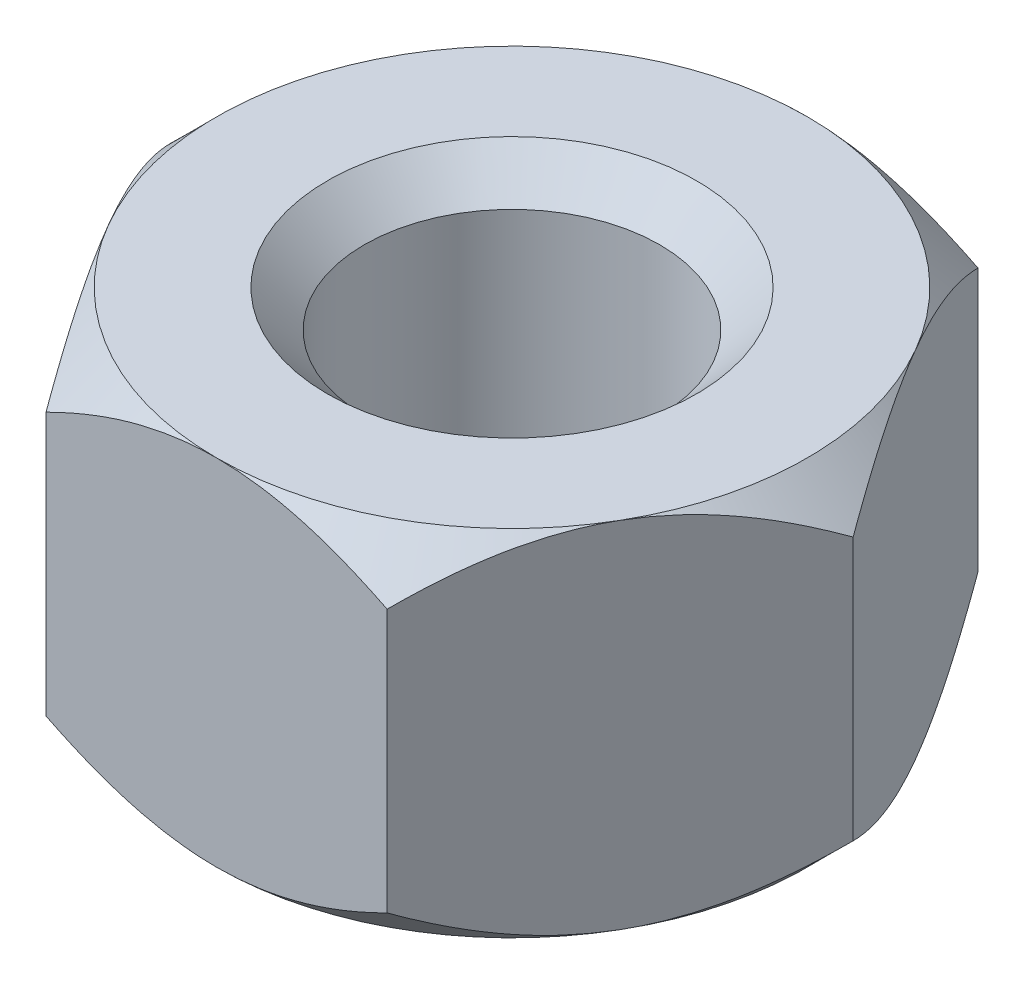
ISO-10303-21;
HEADER;
FILE_DESCRIPTION(('STEP AP214'),'2;1');
FILE_NAME('part.step','',(''),(''),'','','');
FILE_SCHEMA(('AUTOMOTIVE_DESIGN { 1 0 10303 214 1 1 1 1 }'));
ENDSEC;
DATA;
#1=APPLICATION_CONTEXT('core data for automotive mechanical design processes');
#2=APPLICATION_PROTOCOL_DEFINITION('international standard','automotive_design',2000,#1);
#3=PRODUCT_CONTEXT('',#1,'mechanical');
#4=PRODUCT('Part','Part','',(#3));
#5=PRODUCT_RELATED_PRODUCT_CATEGORY('part','',(#4));
#6=PRODUCT_DEFINITION_FORMATION('','',#4);
#7=PRODUCT_DEFINITION_CONTEXT('part definition',#1,'design');
#8=PRODUCT_DEFINITION('design','',#6,#7);
#9=PRODUCT_DEFINITION_SHAPE('','',#8);
#10=(LENGTH_UNIT() NAMED_UNIT(*) SI_UNIT(.MILLI.,.METRE.));
#11=(NAMED_UNIT(*) PLANE_ANGLE_UNIT() SI_UNIT($,.RADIAN.));
#12=(NAMED_UNIT(*) SI_UNIT($,.STERADIAN.) SOLID_ANGLE_UNIT());
#13=UNCERTAINTY_MEASURE_WITH_UNIT(LENGTH_MEASURE(1.E-05),#10,'distance_accuracy_value','');
#14=(GEOMETRIC_REPRESENTATION_CONTEXT(3) GLOBAL_UNCERTAINTY_ASSIGNED_CONTEXT((#13)) GLOBAL_UNIT_ASSIGNED_CONTEXT((#10,
#11,#12)) REPRESENTATION_CONTEXT('',''));
#15=CARTESIAN_POINT('',(0.,0.,0.));
#16=DIRECTION('',(0.,0.,1.));
#17=DIRECTION('',(1.,0.,0.));
#18=AXIS2_PLACEMENT_3D('',#15,#16,#17);
#19=CARTESIAN_POINT('',(0.,2.4,2.));
#20=DIRECTION('',(0.,0.,-1.));
#21=DIRECTION('',(-1.,0.,0.));
#22=AXIS2_PLACEMENT_3D('',#19,#20,#21);
#23=PLANE('',#22);
#24=CARTESIAN_POINT('',(-2.8291899408357,1.4647244798578,2.));
#25=CARTESIAN_POINT('',(-2.75794743497233,1.40656483846488,2.));
#26=CARTESIAN_POINT('',(-2.68635697593311,1.34882463802579,2.));
#27=CARTESIAN_POINT('',(-2.54230476757424,1.23440432711523,2.));
#28=CARTESIAN_POINT('',(-2.46984279924785,1.17772449265718,2.));
#29=CARTESIAN_POINT('',(-2.32311080175362,1.0650636720653,2.));
#30=CARTESIAN_POINT('',(-2.2488296662781,1.00909710308208,2.));
#31=CARTESIAN_POINT('',(-2.09903078687514,0.898854362479401,2.));
#32=CARTESIAN_POINT('',(-2.02351316164895,0.844578030034553,2.));
#33=CARTESIAN_POINT('',(-1.86406396813782,0.733345468454683,2.));
#34=CARTESIAN_POINT('',(-1.77999007510132,0.676592099687395,2.));
#35=CARTESIAN_POINT('',(-1.60961508455424,0.566443579679196,2.));
#36=CARTESIAN_POINT('',(-1.5233132907435,0.513049496705425,2.));
#37=CARTESIAN_POINT('',(-1.34842482772468,0.411062580526362,2.));
#38=CARTESIAN_POINT('',(-1.25985048529424,0.362448805104743,2.));
#39=CARTESIAN_POINT('',(-1.07958965182758,0.271445900810976,2.));
#40=CARTESIAN_POINT('',(-0.987905878867413,0.22905149963363,2.));
#41=CARTESIAN_POINT('',(-0.827220008254675,0.163453909358535,2.));
#42=CARTESIAN_POINT('',(-0.759060459986962,0.138201761805597,2.));
#43=CARTESIAN_POINT('',(-0.620921054554501,0.0931513278392925,2.));
#44=CARTESIAN_POINT('',(-0.550940948384456,0.0733537918137,2.));
#45=CARTESIAN_POINT('',(-0.410970866170769,0.0406797291698716,2.));
#46=CARTESIAN_POINT('',(-0.341014587421594,0.0276612891194157,2.));
#47=CARTESIAN_POINT('',(-0.200136764107186,0.00877832788195313,2.));
#48=CARTESIAN_POINT('',(-0.129215444692074,0.00291216600773918,2.));
#49=CARTESIAN_POINT('',(0.00930537263127748,-0.00111681136780149,2.));
#50=CARTESIAN_POINT('',(0.0768941424091716,0.00035078729153876,2.));
#51=CARTESIAN_POINT('',(0.211581548624999,0.0100379998375035,2.));
#52=CARTESIAN_POINT('',(0.27868014872778,0.0182581092496755,2.));
#53=CARTESIAN_POINT('',(0.413072803988463,0.0411162729747647,2.));
#54=CARTESIAN_POINT('',(0.480346226016125,0.0558736223264092,2.));
#55=CARTESIAN_POINT('',(0.613391847110031,0.0909640848891721,2.));
#56=CARTESIAN_POINT('',(0.679164086708457,0.111297047364406,2.));
#57=CARTESIAN_POINT('',(0.87826902904644,0.180713473259486,2.));
#58=CARTESIAN_POINT('',(1.00895593784598,0.237354634088662,2.));
#59=CARTESIAN_POINT('',(1.2642523527517,0.363457849088134,2.));
#60=CARTESIAN_POINT('',(1.38883880003726,0.432964414597252,2.));
#61=CARTESIAN_POINT('',(1.56893345594384,0.541543563498943,2.));
#62=CARTESIAN_POINT('',(1.62638925138213,0.577450474387938,2.));
#63=CARTESIAN_POINT('',(1.74031418052643,0.650808508938124,2.));
#64=CARTESIAN_POINT('',(1.79678324047045,0.688259747346152,2.));
#65=CARTESIAN_POINT('',(1.90841199745023,0.764122452153494,2.));
#66=CARTESIAN_POINT('',(1.96357854085903,0.802523895281548,2.));
#67=CARTESIAN_POINT('',(2.07315352459833,0.880363201789675,2.));
#68=CARTESIAN_POINT('',(2.1275621696592,0.919800776633909,2.));
#69=CARTESIAN_POINT('',(2.18165265473574,0.959663546066592,2.));
#70=B_SPLINE_CURVE_WITH_KNOTS('',3,(#24,#25,#26,#27,#28,#29,#30,#31,#32,#33,#34,#35,#36,#37,#38,
#39,#40,#41,#42,#43,#44,#45,#46,#47,#48,#49,#50,#51,#52,#53,#54,#55,#56,#57,#58,#59,#60,#61,#62,
#63,#64,#65,#66,#67,#68,#69),.UNSPECIFIED.,.F.,.F.,(4,2,2,2,2,2,2,2,2,2,2,2,2,2,2,2,2,2,2,2,2,2,
4),(0.,0.275907547813032,0.55188594224357,0.830881846747023,1.1098511232736,1.41410044793124,
1.7184460411623,2.02139261300563,2.32408086743551,2.54195930357539,2.75986769817752,
2.97300971438962,3.18610282797173,3.38856871258356,3.59104945625827,3.79738799829161,
4.00372096254256,4.42979047953389,4.85736262875748,5.06060251813806,5.26385753598405,
5.46549374474189,5.66707438606444),.UNSPECIFIED.);
#71=CARTESIAN_POINT('',(1.15470053837925,0.309401076758503,2.));
#72=VERTEX_POINT('',#71);
#73=CARTESIAN_POINT('',(0.,0.,2.));
#74=VERTEX_POINT('',#73);
#75=EDGE_CURVE('E124',#72,#74,#70,.F.);
#76=ORIENTED_EDGE('',*,*,#75,.F.);
#77=DIRECTION('',(0.,-1.,0.));
#78=VECTOR('',#77,1.);
#79=CARTESIAN_POINT('',(1.15470053837925,2.4,2.));
#80=LINE('',#79,#78);
#81=CARTESIAN_POINT('',(1.15470053837925,2.0905989232415,2.));
#82=VERTEX_POINT('',#81);
#83=EDGE_CURVE('E322',#82,#72,#80,.T.);
#84=ORIENTED_EDGE('',*,*,#83,.F.);
#85=CARTESIAN_POINT('',(-2.8291899408357,0.935275520142197,2.));
#86=CARTESIAN_POINT('',(-2.75794743497233,0.993435161535117,2.));
#87=CARTESIAN_POINT('',(-2.68635697593311,1.05117536197421,2.));
#88=CARTESIAN_POINT('',(-2.54230476757424,1.16559567288477,2.));
#89=CARTESIAN_POINT('',(-2.46984279924785,1.22227550734282,2.));
#90=CARTESIAN_POINT('',(-2.32311080175362,1.3349363279347,2.));
#91=CARTESIAN_POINT('',(-2.2488296662781,1.39090289691792,2.));
#92=CARTESIAN_POINT('',(-2.09903078687514,1.5011456375206,2.));
#93=CARTESIAN_POINT('',(-2.02351316164895,1.55542196996545,2.));
#94=CARTESIAN_POINT('',(-1.86406396813782,1.66665453154532,2.));
#95=CARTESIAN_POINT('',(-1.77999007510132,1.7234079003126,2.));
#96=CARTESIAN_POINT('',(-1.60961508455424,1.8335564203208,2.));
#97=CARTESIAN_POINT('',(-1.5233132907435,1.88695050329458,2.));
#98=CARTESIAN_POINT('',(-1.34842482772468,1.98893741947364,2.));
#99=CARTESIAN_POINT('',(-1.25985048529424,2.03755119489526,2.));
#100=CARTESIAN_POINT('',(-1.07958965182758,2.12855409918902,2.));
#101=CARTESIAN_POINT('',(-0.987905878867413,2.17094850036637,2.));
#102=CARTESIAN_POINT('',(-0.827220008254675,2.23654609064146,2.));
#103=CARTESIAN_POINT('',(-0.759060459986962,2.2617982381944,2.));
#104=CARTESIAN_POINT('',(-0.620921054554502,2.30684867216071,2.));
#105=CARTESIAN_POINT('',(-0.550940948384456,2.3266462081863,2.));
#106=CARTESIAN_POINT('',(-0.410970866170769,2.35932027083013,2.));
#107=CARTESIAN_POINT('',(-0.341014587421594,2.37233871088058,2.));
#108=CARTESIAN_POINT('',(-0.200136764107186,2.39122167211805,2.));
#109=CARTESIAN_POINT('',(-0.129215444692074,2.39708783399226,2.));
#110=CARTESIAN_POINT('',(0.0093053726312774,2.4011168113678,2.));
#111=CARTESIAN_POINT('',(0.0768941424091715,2.39964921270846,2.));
#112=CARTESIAN_POINT('',(0.211581548624998,2.3899620001625,2.));
#113=CARTESIAN_POINT('',(0.27868014872778,2.38174189075032,2.));
#114=CARTESIAN_POINT('',(0.413072803988463,2.35888372702523,2.));
#115=CARTESIAN_POINT('',(0.480346226016125,2.34412637767359,2.));
#116=CARTESIAN_POINT('',(0.613391847110031,2.30903591511083,2.));
#117=CARTESIAN_POINT('',(0.679164086708457,2.28870295263559,2.));
#118=CARTESIAN_POINT('',(0.878269029046439,2.21928652674051,2.));
#119=CARTESIAN_POINT('',(1.00895593784598,2.16264536591134,2.));
#120=CARTESIAN_POINT('',(1.2642523527517,2.03654215091187,2.));
#121=CARTESIAN_POINT('',(1.38883880003726,1.96703558540275,2.));
#122=CARTESIAN_POINT('',(1.56893345594384,1.85845643650106,2.));
#123=CARTESIAN_POINT('',(1.62638925138213,1.82254952561206,2.));
#124=CARTESIAN_POINT('',(1.74031418052643,1.74919149106188,2.));
#125=CARTESIAN_POINT('',(1.79678324047045,1.71174025265385,2.));
#126=CARTESIAN_POINT('',(1.90841199745023,1.63587754784651,2.));
#127=CARTESIAN_POINT('',(1.96357854085903,1.59747610471845,2.));
#128=CARTESIAN_POINT('',(2.07315352459833,1.51963679821032,2.));
#129=CARTESIAN_POINT('',(2.1275621696592,1.48019922336609,2.));
#130=CARTESIAN_POINT('',(2.18165265473573,1.44033645393341,2.));
#131=B_SPLINE_CURVE_WITH_KNOTS('',3,(#85,#86,#87,#88,#89,#90,#91,#92,#93,#94,#95,#96,#97,#98,
#99,#100,#101,#102,#103,#104,#105,#106,#107,#108,#109,#110,#111,#112,#113,#114,#115,#116,#117,
#118,#119,#120,#121,#122,#123,#124,#125,#126,#127,#128,#129,#130),.UNSPECIFIED.,.F.,.F.,(4,2,2,
2,2,2,2,2,2,2,2,2,2,2,2,2,2,2,2,2,2,2,4),(0.,0.275907547813032,0.55188594224357,
0.830881846747023,1.1098511232736,1.41410044793124,1.7184460411623,2.02139261300563,
2.32408086743551,2.54195930357539,2.75986769817752,2.97300971438962,3.18610282797173,
3.38856871258356,3.59104945625827,3.79738799829161,4.00372096254256,4.42979047953389,
4.85736262875748,5.06060251813806,5.26385753598405,5.46549374474189,5.66707438606444),.UNSPECIFIED.);
#132=CARTESIAN_POINT('',(0.,2.4,2.));
#133=VERTEX_POINT('',#132);
#134=EDGE_CURVE('E195',#133,#82,#131,.T.);
#135=ORIENTED_EDGE('',*,*,#134,.F.);
#136=CARTESIAN_POINT('',(-1.15470053837925,2.0905989232415,2.));
#137=VERTEX_POINT('',#136);
#138=EDGE_CURVE('E202',#137,#133,#131,.T.);
#139=ORIENTED_EDGE('',*,*,#138,.F.);
#140=DIRECTION('',(0.,-1.,0.));
#141=VECTOR('',#140,1.);
#142=CARTESIAN_POINT('',(-1.15470053837925,2.4,2.));
#143=LINE('',#142,#141);
#144=CARTESIAN_POINT('',(-1.15470053837925,0.309401076758502,2.));
#145=VERTEX_POINT('',#144);
#146=EDGE_CURVE('E159',#137,#145,#143,.T.);
#147=ORIENTED_EDGE('',*,*,#146,.T.);
#148=EDGE_CURVE('E137',#74,#145,#70,.F.);
#149=ORIENTED_EDGE('',*,*,#148,.F.);
#150=EDGE_LOOP('',(#76,#84,#135,#139,#147,#149));
#151=FACE_BOUND('',#150,.T.);
#152=ADVANCED_FACE('F35',(#151),#23,.F.);
#153=CARTESIAN_POINT('',(1.73205080756888,2.4,1.));
#154=DIRECTION('',(-0.866025403784439,0.,-0.5));
#155=DIRECTION('',(-0.5,0.,0.866025403784439));
#156=AXIS2_PLACEMENT_3D('',#153,#154,#155);
#157=PLANE('',#156);
#158=CARTESIAN_POINT('',(2.30951654681234,0.309516555472161,-0.000199999999998549));
#159=CARTESIAN_POINT('',(2.26982196410711,0.269854166984094,0.0685530340307065));
#160=CARTESIAN_POINT('',(2.22946361676572,0.232521059042664,0.138455742135512));
#161=CARTESIAN_POINT('',(2.1471683966763,0.164164761894645,0.280995244550437));
#162=CARTESIAN_POINT('',(2.10522369580642,0.133179610495723,0.353645597565358));
#163=CARTESIAN_POINT('',(2.02064418875706,0.0801012933026448,0.500141601053971));
#164=CARTESIAN_POINT('',(1.97803092714269,0.0578747039351133,0.573949935246294));
#165=CARTESIAN_POINT('',(1.89186619344273,0.023629893433583,0.723191631835263));
#166=CARTESIAN_POINT('',(1.84831735425552,0.011586105902637,0.79862043391815));
#167=CARTESIAN_POINT('',(1.7732646674724,0.000719588664073888,0.928615500671077));
#168=CARTESIAN_POINT('',(1.74185780396625,-0.000889169631527572,0.983013783970107));
#169=CARTESIAN_POINT('',(1.67909540053412,0.00181995435721312,1.09172145551969));
#170=CARTESIAN_POINT('',(1.64773988246022,0.00613991451647587,1.14603080592134));
#171=CARTESIAN_POINT('',(1.58532489948421,0.0204606441684073,1.25413672758933));
#172=CARTESIAN_POINT('',(1.55426580541469,0.0304677695205077,1.30793265655479));
#173=CARTESIAN_POINT('',(1.49268469862228,0.0556135070081603,1.41459426230557));
#174=CARTESIAN_POINT('',(1.46216264491917,0.0707517258007405,1.46746001007071));
#175=CARTESIAN_POINT('',(1.38397803138049,0.115695580187691,1.60287973308984));
#176=CARTESIAN_POINT('',(1.33680037273297,0.148889916184317,1.68459383484948));
#177=CARTESIAN_POINT('',(1.26742988897853,0.204926899929871,1.8047470372578));
#178=CARTESIAN_POINT('',(1.24456923461531,0.224615779705442,1.84434285210918));
#179=CARTESIAN_POINT('',(1.19927142554652,0.265788395123374,1.92280095888787));
#180=CARTESIAN_POINT('',(1.17683402097615,0.287271028409749,1.96166368359374));
#181=CARTESIAN_POINT('',(1.15458506832541,0.309516555472162,2.0002));
#182=B_SPLINE_CURVE_WITH_KNOTS('',3,(#158,#159,#160,#161,#162,#163,#164,#165,#166,#167,#168,
#169,#170,#171,#172,#173,#174,#175,#176,#177,#178,#179,#180,#181),.UNSPECIFIED.,.F.,.F.,(4,2,2,
2,2,2,2,2,2,2,2,4),(0.,0.266420613771063,0.534393751523386,0.798110374376911,1.06116288956936,
1.24939906803721,1.43770123566247,1.62621426093931,1.81471283831913,2.11415604834144,
2.2634717071779,2.41269626969771),.UNSPECIFIED.);
#183=CARTESIAN_POINT('',(2.3094010767585,0.309401076758502,0.));
#184=VERTEX_POINT('',#183);
#185=CARTESIAN_POINT('',(1.73205080756888,0.,1.));
#186=VERTEX_POINT('',#185);
#187=EDGE_CURVE('E50',#184,#186,#182,.T.);
#188=ORIENTED_EDGE('',*,*,#187,.F.);
#189=DIRECTION('',(0.,-1.,0.));
#190=VECTOR('',#189,1.);
#191=CARTESIAN_POINT('',(2.3094010767585,2.4,0.));
#192=LINE('',#191,#190);
#193=CARTESIAN_POINT('',(2.3094010767585,2.0905989232415,0.));
#194=VERTEX_POINT('',#193);
#195=EDGE_CURVE('E316',#194,#184,#192,.T.);
#196=ORIENTED_EDGE('',*,*,#195,.F.);
#197=CARTESIAN_POINT('',(1.15458506832541,2.09048344452784,2.0002));
#198=CARTESIAN_POINT('',(1.19427965103065,2.1301458330159,1.93144696596929));
#199=CARTESIAN_POINT('',(1.23463799837204,2.16747894095733,1.86154425786449));
#200=CARTESIAN_POINT('',(1.31693321846145,2.23583523810535,1.71900475544956));
#201=CARTESIAN_POINT('',(1.35887791933134,2.26682038950428,1.64635440243464));
#202=CARTESIAN_POINT('',(1.44345742638069,2.31989870669735,1.49985839894603));
#203=CARTESIAN_POINT('',(1.48607068799507,2.34212529606489,1.42605006475371));
#204=CARTESIAN_POINT('',(1.57223542169503,2.37637010656642,1.27680836816474));
#205=CARTESIAN_POINT('',(1.61578426088223,2.38841389409736,1.20137956608185));
#206=CARTESIAN_POINT('',(1.69083694766536,2.39928041133593,1.07138449932892));
#207=CARTESIAN_POINT('',(1.72224381117151,2.40088916963153,1.01698621602989));
#208=CARTESIAN_POINT('',(1.78500621460364,2.39818004564279,0.908278544480309));
#209=CARTESIAN_POINT('',(1.81636173267754,2.39386008548352,0.853969194078663));
#210=CARTESIAN_POINT('',(1.87877671565355,2.37953935583159,0.745863272410665));
#211=CARTESIAN_POINT('',(1.90983580972306,2.36953223047949,0.69206734344521));
#212=CARTESIAN_POINT('',(1.97141691651547,2.34438649299184,0.58540573769443));
#213=CARTESIAN_POINT('',(2.00193897021859,2.32924827419926,0.53253998992929));
#214=CARTESIAN_POINT('',(2.08012358375727,2.28430441981231,0.397120266910159));
#215=CARTESIAN_POINT('',(2.12730124240478,2.25111008381568,0.315406165150524));
#216=CARTESIAN_POINT('',(2.19667172615922,2.19507310007013,0.1952529627422));
#217=CARTESIAN_POINT('',(2.21953238052245,2.17538422029456,0.155657147890825));
#218=CARTESIAN_POINT('',(2.26483018959124,2.13421160487663,0.0771990411121293));
#219=CARTESIAN_POINT('',(2.28726759416161,2.11272897159025,0.0383363164062611));
#220=CARTESIAN_POINT('',(2.30951654681234,2.09048344452784,-0.000199999999998536));
#221=B_SPLINE_CURVE_WITH_KNOTS('',3,(#197,#198,#199,#200,#201,#202,#203,#204,#205,#206,#207,
#208,#209,#210,#211,#212,#213,#214,#215,#216,#217,#218,#219,#220),.UNSPECIFIED.,.F.,.F.,(4,2,2,
2,2,2,2,2,2,2,2,4),(0.,0.266420613771063,0.534393751523388,0.798110374376913,1.06116288956936,
1.24939906803721,1.43770123566247,1.62621426093931,1.81471283831913,2.11415604834144,
2.2634717071779,2.41269626969771),.UNSPECIFIED.);
#222=CARTESIAN_POINT('',(1.73205080756888,2.4,1.));
#223=VERTEX_POINT('',#222);
#224=EDGE_CURVE('E204',#223,#194,#221,.T.);
#225=ORIENTED_EDGE('',*,*,#224,.F.);
#226=EDGE_CURVE('E203',#82,#223,#221,.T.);
#227=ORIENTED_EDGE('',*,*,#226,.F.);
#228=ORIENTED_EDGE('',*,*,#83,.T.);
#229=EDGE_CURVE('E131',#186,#72,#182,.T.);
#230=ORIENTED_EDGE('',*,*,#229,.F.);
#231=EDGE_LOOP('',(#188,#196,#225,#227,#228,#230));
#232=FACE_BOUND('',#231,.T.);
#233=ADVANCED_FACE('F189',(#232),#157,.F.);
#234=CARTESIAN_POINT('',(1.73205080756888,2.4,-1.));
#235=DIRECTION('',(-0.866025403784438,0.,0.5));
#236=DIRECTION('',(0.5,0.,0.866025403784439));
#237=AXIS2_PLACEMENT_3D('',#234,#235,#236);
#238=PLANE('',#237);
#239=CARTESIAN_POINT('',(1.15458506832541,0.309516555472161,-2.0002));
#240=CARTESIAN_POINT('',(1.19427965103064,0.269854166984093,-1.93144696596929));
#241=CARTESIAN_POINT('',(1.23463799837204,0.232521059042663,-1.86154425786449));
#242=CARTESIAN_POINT('',(1.31693321846145,0.164164761894644,-1.71900475544956));
#243=CARTESIAN_POINT('',(1.35887791933133,0.133179610495722,-1.64635440243464));
#244=CARTESIAN_POINT('',(1.44345742638069,0.0801012933026435,-1.49985839894603));
#245=CARTESIAN_POINT('',(1.48607068799507,0.0578747039351114,-1.42605006475371));
#246=CARTESIAN_POINT('',(1.57223542169502,0.0236298934335809,-1.27680836816474));
#247=CARTESIAN_POINT('',(1.61578426088223,0.0115861059026352,-1.20137956608185));
#248=CARTESIAN_POINT('',(1.69083694766536,0.000719588664072184,-1.07138449932892));
#249=CARTESIAN_POINT('',(1.7222438111715,-0.00088916963152938,-1.01698621602989));
#250=CARTESIAN_POINT('',(1.78500621460363,0.00181995435721102,-0.90827854448031));
#251=CARTESIAN_POINT('',(1.81636173267754,0.00613991451647358,-0.853969194078665));
#252=CARTESIAN_POINT('',(1.87877671565355,0.0204606441684051,-0.745863272410666));
#253=CARTESIAN_POINT('',(1.90983580972306,0.0304677695205058,-0.692067343445213));
#254=CARTESIAN_POINT('',(1.97141691651547,0.0556135070081583,-0.585405737694432));
#255=CARTESIAN_POINT('',(2.00193897021858,0.0707517258007381,-0.532539989929293));
#256=CARTESIAN_POINT('',(2.08012358375726,0.115695580187688,-0.39712026691016));
#257=CARTESIAN_POINT('',(2.12730124240478,0.148889916184315,-0.315406165150525));
#258=CARTESIAN_POINT('',(2.19667172615922,0.20492689992987,-0.195252962742199));
#259=CARTESIAN_POINT('',(2.21953238052245,0.22461577970544,-0.155657147890824));
#260=CARTESIAN_POINT('',(2.26483018959123,0.265788395123372,-0.0771990411121272));
#261=CARTESIAN_POINT('',(2.28726759416161,0.287271028409748,-0.0383363164062586));
#262=CARTESIAN_POINT('',(2.30951654681234,0.309516555472162,0.000200000000001497));
#263=B_SPLINE_CURVE_WITH_KNOTS('',3,(#239,#240,#241,#242,#243,#244,#245,#246,#247,#248,#249,
#250,#251,#252,#253,#254,#255,#256,#257,#258,#259,#260,#261,#262),.UNSPECIFIED.,.F.,.F.,(4,2,2,
2,2,2,2,2,2,2,2,4),(0.,0.266420613771063,0.534393751523387,0.798110374376912,1.06116288956936,
1.24939906803721,1.43770123566247,1.62621426093931,1.81471283831913,2.11415604834144,
2.26347170717791,2.41269626969771),.UNSPECIFIED.);
#264=CARTESIAN_POINT('',(1.15470053837925,0.309401076758501,-2.));
#265=VERTEX_POINT('',#264);
#266=CARTESIAN_POINT('',(1.73205080756888,0.,-1.));
#267=VERTEX_POINT('',#266);
#268=EDGE_CURVE('E58',#265,#267,#263,.T.);
#269=ORIENTED_EDGE('',*,*,#268,.F.);
#270=DIRECTION('',(0.,-1.,0.));
#271=VECTOR('',#270,1.);
#272=CARTESIAN_POINT('',(1.15470053837925,2.4,-2.));
#273=LINE('',#272,#271);
#274=CARTESIAN_POINT('',(1.15470053837925,2.0905989232415,-2.));
#275=VERTEX_POINT('',#274);
#276=EDGE_CURVE('E313',#275,#265,#273,.T.);
#277=ORIENTED_EDGE('',*,*,#276,.F.);
#278=CARTESIAN_POINT('',(2.30951654681234,2.09048344452784,0.000200000000001518));
#279=CARTESIAN_POINT('',(2.26982196410711,2.13014583301591,-0.068553034030704));
#280=CARTESIAN_POINT('',(2.22946361676572,2.16747894095734,-0.13845574213551));
#281=CARTESIAN_POINT('',(2.1471683966763,2.23583523810536,-0.280995244550435));
#282=CARTESIAN_POINT('',(2.10522369580642,2.26682038950428,-0.353645597565357));
#283=CARTESIAN_POINT('',(2.02064418875706,2.31989870669736,-0.50014160105397));
#284=CARTESIAN_POINT('',(1.97803092714269,2.34212529606489,-0.573949935246293));
#285=CARTESIAN_POINT('',(1.89186619344273,2.37637010656642,-0.723191631835263));
#286=CARTESIAN_POINT('',(1.84831735425552,2.38841389409736,-0.798620433918151));
#287=CARTESIAN_POINT('',(1.7732646674724,2.39928041133593,-0.928615500671078));
#288=CARTESIAN_POINT('',(1.74185780396625,2.40088916963153,-0.983013783970107));
#289=CARTESIAN_POINT('',(1.67909540053412,2.39818004564279,-1.09172145551969));
#290=CARTESIAN_POINT('',(1.64773988246021,2.39386008548353,-1.14603080592134));
#291=CARTESIAN_POINT('',(1.5853248994842,2.37953935583159,-1.25413672758934));
#292=CARTESIAN_POINT('',(1.55426580541469,2.36953223047949,-1.30793265655479));
#293=CARTESIAN_POINT('',(1.49268469862228,2.34438649299184,-1.41459426230557));
#294=CARTESIAN_POINT('',(1.46216264491917,2.32924827419926,-1.46746001007071));
#295=CARTESIAN_POINT('',(1.38397803138049,2.28430441981231,-1.60287973308984));
#296=CARTESIAN_POINT('',(1.33680037273297,2.25111008381568,-1.68459383484948));
#297=CARTESIAN_POINT('',(1.26742988897853,2.19507310007013,-1.8047470372578));
#298=CARTESIAN_POINT('',(1.24456923461531,2.17538422029456,-1.84434285210918));
#299=CARTESIAN_POINT('',(1.19927142554652,2.13421160487663,-1.92280095888787));
#300=CARTESIAN_POINT('',(1.17683402097614,2.11272897159025,-1.96166368359374));
#301=CARTESIAN_POINT('',(1.15458506832541,2.09048344452784,-2.0002));
#302=B_SPLINE_CURVE_WITH_KNOTS('',3,(#278,#279,#280,#281,#282,#283,#284,#285,#286,#287,#288,
#289,#290,#291,#292,#293,#294,#295,#296,#297,#298,#299,#300,#301),.UNSPECIFIED.,.F.,.F.,(4,2,2,
2,2,2,2,2,2,2,2,4),(0.,0.266420613771064,0.534393751523389,0.798110374376915,1.06116288956936,
1.24939906803722,1.43770123566247,1.62621426093932,1.81471283831913,2.11415604834145,
2.26347170717791,2.41269626969771),.UNSPECIFIED.);
#303=CARTESIAN_POINT('',(1.73205080756888,2.4,-1.));
#304=VERTEX_POINT('',#303);
#305=EDGE_CURVE('E245',#304,#275,#302,.T.);
#306=ORIENTED_EDGE('',*,*,#305,.F.);
#307=EDGE_CURVE('E250',#194,#304,#302,.T.);
#308=ORIENTED_EDGE('',*,*,#307,.F.);
#309=ORIENTED_EDGE('',*,*,#195,.T.);
#310=EDGE_CURVE('E260',#267,#184,#263,.T.);
#311=ORIENTED_EDGE('',*,*,#310,.F.);
#312=EDGE_LOOP('',(#269,#277,#306,#308,#309,#311));
#313=FACE_BOUND('',#312,.T.);
#314=ADVANCED_FACE('F252',(#313),#238,.F.);
#315=CARTESIAN_POINT('',(0.,2.4,-2.));
#316=DIRECTION('',(0.,0.,1.));
#317=DIRECTION('',(1.,0.,0.));
#318=AXIS2_PLACEMENT_3D('',#315,#316,#317);
#319=PLANE('',#318);
#320=CARTESIAN_POINT('',(-2.8291899407841,1.46472447981566,-2.));
#321=CARTESIAN_POINT('',(-2.75794743492228,1.40656483842437,-2.));
#322=CARTESIAN_POINT('',(-2.68635697588463,1.3488246379869,-2.));
#323=CARTESIAN_POINT('',(-2.54230476752889,1.23440432707959,-2.));
#324=CARTESIAN_POINT('',(-2.46984279920408,1.17772449262316,-2.));
#325=CARTESIAN_POINT('',(-2.32311080171305,1.06506367203456,-2.));
#326=CARTESIAN_POINT('',(-2.24882966623916,1.00909710305299,-2.));
#327=CARTESIAN_POINT('',(-2.09903078683948,0.898854362453591,-2.));
#328=CARTESIAN_POINT('',(-2.02351316161494,0.844578030010375,-2.));
#329=CARTESIAN_POINT('',(-1.86406396810748,0.733345468434019,-2.));
#330=CARTESIAN_POINT('',(-1.77999007507302,0.676592099668604,-2.));
#331=CARTESIAN_POINT('',(-1.60961508453008,0.566443579664072,-2.));
#332=CARTESIAN_POINT('',(-1.52331329072144,0.513049496692097,-2.));
#333=CARTESIAN_POINT('',(-1.34842482770692,0.41106258051647,-2.));
#334=CARTESIAN_POINT('',(-1.25985048527866,0.362448805096493,-2.));
#335=CARTESIAN_POINT('',(-1.07958965181652,0.271445900805778,-2.));
#336=CARTESIAN_POINT('',(-0.987905878858677,0.22905149962984,-2.));
#337=CARTESIAN_POINT('',(-0.827220008247531,0.163453909355781,-2.));
#338=CARTESIAN_POINT('',(-0.75906045997897,0.138201761802732,-2.));
#339=CARTESIAN_POINT('',(-0.620921054544778,0.0931513278363802,-2.));
#340=CARTESIAN_POINT('',(-0.55094094837385,0.0733537918108503,-2.));
#341=CARTESIAN_POINT('',(-0.410970866158424,0.0406797291673564,-2.));
#342=CARTESIAN_POINT('',(-0.341014587408396,0.0276612891171656,-2.));
#343=CARTESIAN_POINT('',(-0.200136764092302,0.00877832788043948,-2.));
#344=CARTESIAN_POINT('',(-0.129215444676358,0.00291216600669666,-2.));
#345=CARTESIAN_POINT('',(0.00930537264836044,-0.00111681136774189,-2.));
#346=CARTESIAN_POINT('',(0.0768941424267924,0.000350787292200434,-2.));
#347=CARTESIAN_POINT('',(0.211581548643628,0.0100379998394491,-2.));
#348=CARTESIAN_POINT('',(0.27868014874688,0.018258109252303,-2.));
#349=CARTESIAN_POINT('',(0.413072804008493,0.0411162729788068,-2.));
#350=CARTESIAN_POINT('',(0.480346226036613,0.0558736223311887,-2.));
#351=CARTESIAN_POINT('',(0.613391847131379,0.0909640848954276,-2.));
#352=CARTESIAN_POINT('',(0.679164086730209,0.1112970473714,-2.));
#353=CARTESIAN_POINT('',(0.878269029072744,0.180713473269879,-2.));
#354=CARTESIAN_POINT('',(1.0089559378762,0.237354634102169,-2.));
#355=CARTESIAN_POINT('',(1.26425235278946,0.363457849108216,-2.));
#356=CARTESIAN_POINT('',(1.38883880007863,0.432964414620798,-2.));
#357=CARTESIAN_POINT('',(1.56893345599022,0.541543563527562,-2.));
#358=CARTESIAN_POINT('',(1.62638925142996,0.577450474418112,-2.));
#359=CARTESIAN_POINT('',(1.74031418057716,0.650808508971418,-2.));
#360=CARTESIAN_POINT('',(1.79678324052262,0.688259747381009,-2.));
#361=CARTESIAN_POINT('',(1.90841199750523,0.764122452191459,-2.));
#362=CARTESIAN_POINT('',(1.96357854091543,0.802523895321058,-2.));
#363=CARTESIAN_POINT('',(2.07315352465752,0.880363201832273,-2.));
#364=CARTESIAN_POINT('',(2.12756216971978,0.919800776678049,-2.));
#365=CARTESIAN_POINT('',(2.18165265479771,0.959663546112273,-2.));
#366=B_SPLINE_CURVE_WITH_KNOTS('',3,(#320,#321,#322,#323,#324,#325,#326,#327,#328,#329,#330,
#331,#332,#333,#334,#335,#336,#337,#338,#339,#340,#341,#342,#343,#344,#345,#346,#347,#348,#349,
#350,#351,#352,#353,#354,#355,#356,#357,#358,#359,#360,#361,#362,#363,#364,#365),.UNSPECIFIED.,
.F.,.F.,(4,2,2,2,2,2,2,2,2,2,2,2,2,2,2,2,2,2,2,2,2,2,4),(0.,0.275907547806318,0.551885942230141,
0.83088184672671,1.10985112324641,1.41410044789585,1.71844604111871,2.02139261295393,
2.32408086737571,2.54195930351808,2.75986769812271,2.97300971433716,3.18610282792162,
3.3885687125351,3.59104945621145,3.79738799824661,4.00372096249937,4.42979047950514,
4.85736262874326,5.06060251813003,5.26385753598219,5.46549374474613,5.66707438607478),.UNSPECIFIED.);
#367=CARTESIAN_POINT('',(-1.15470053837925,0.309401076758503,-2.));
#368=VERTEX_POINT('',#367);
#369=CARTESIAN_POINT('',(0.,0.,-2.));
#370=VERTEX_POINT('',#369);
#371=EDGE_CURVE('E175',#368,#370,#366,.T.);
#372=ORIENTED_EDGE('',*,*,#371,.F.);
#373=DIRECTION('',(0.,-1.,0.));
#374=VECTOR('',#373,1.);
#375=CARTESIAN_POINT('',(-1.15470053837925,2.4,-2.));
#376=LINE('',#375,#374);
#377=CARTESIAN_POINT('',(-1.15470053837925,2.0905989232415,-2.));
#378=VERTEX_POINT('',#377);
#379=EDGE_CURVE('E309',#378,#368,#376,.T.);
#380=ORIENTED_EDGE('',*,*,#379,.F.);
#381=CARTESIAN_POINT('',(-2.8291899407841,0.935275520184337,-2.));
#382=CARTESIAN_POINT('',(-2.75794743492229,0.99343516157563,-2.));
#383=CARTESIAN_POINT('',(-2.68635697588463,1.0511753620131,-2.));
#384=CARTESIAN_POINT('',(-2.54230476752889,1.16559567292041,-2.));
#385=CARTESIAN_POINT('',(-2.46984279920408,1.22227550737684,-2.));
#386=CARTESIAN_POINT('',(-2.32311080171305,1.33493632796544,-2.));
#387=CARTESIAN_POINT('',(-2.24882966623916,1.39090289694701,-2.));
#388=CARTESIAN_POINT('',(-2.09903078683948,1.50114563754641,-2.));
#389=CARTESIAN_POINT('',(-2.02351316161494,1.55542196998962,-2.));
#390=CARTESIAN_POINT('',(-1.86406396810748,1.66665453156598,-2.));
#391=CARTESIAN_POINT('',(-1.77999007507302,1.7234079003314,-2.));
#392=CARTESIAN_POINT('',(-1.60961508453008,1.83355642033593,-2.));
#393=CARTESIAN_POINT('',(-1.52331329072144,1.8869505033079,-2.));
#394=CARTESIAN_POINT('',(-1.34842482770692,1.98893741948353,-2.));
#395=CARTESIAN_POINT('',(-1.25985048527866,2.03755119490351,-2.));
#396=CARTESIAN_POINT('',(-1.07958965181652,2.12855409919422,-2.));
#397=CARTESIAN_POINT('',(-0.987905878858678,2.17094850037016,-2.));
#398=CARTESIAN_POINT('',(-0.827220008247531,2.23654609064422,-2.));
#399=CARTESIAN_POINT('',(-0.75906045997897,2.26179823819727,-2.));
#400=CARTESIAN_POINT('',(-0.620921054544779,2.30684867216362,-2.));
#401=CARTESIAN_POINT('',(-0.55094094837385,2.32664620818915,-2.));
#402=CARTESIAN_POINT('',(-0.410970866158424,2.35932027083264,-2.));
#403=CARTESIAN_POINT('',(-0.341014587408396,2.37233871088283,-2.));
#404=CARTESIAN_POINT('',(-0.200136764092302,2.39122167211956,-2.));
#405=CARTESIAN_POINT('',(-0.129215444676359,2.3970878339933,-2.));
#406=CARTESIAN_POINT('',(0.00930537264836034,2.40111681136774,-2.));
#407=CARTESIAN_POINT('',(0.0768941424267923,2.3996492127078,-2.));
#408=CARTESIAN_POINT('',(0.211581548643628,2.38996200016055,-2.));
#409=CARTESIAN_POINT('',(0.27868014874688,2.3817418907477,-2.));
#410=CARTESIAN_POINT('',(0.413072804008493,2.35888372702119,-2.));
#411=CARTESIAN_POINT('',(0.480346226036613,2.34412637766881,-2.));
#412=CARTESIAN_POINT('',(0.613391847131379,2.30903591510457,-2.));
#413=CARTESIAN_POINT('',(0.679164086730209,2.2887029526286,-2.));
#414=CARTESIAN_POINT('',(0.878269029072744,2.21928652673012,-2.));
#415=CARTESIAN_POINT('',(1.0089559378762,2.16264536589783,-2.));
#416=CARTESIAN_POINT('',(1.26425235278946,2.03654215089178,-2.));
#417=CARTESIAN_POINT('',(1.38883880007863,1.9670355853792,-2.));
#418=CARTESIAN_POINT('',(1.56893345599022,1.85845643647244,-2.));
#419=CARTESIAN_POINT('',(1.62638925142996,1.82254952558189,-2.));
#420=CARTESIAN_POINT('',(1.74031418057716,1.74919149102858,-2.));
#421=CARTESIAN_POINT('',(1.79678324052262,1.71174025261899,-2.));
#422=CARTESIAN_POINT('',(1.90841199750523,1.63587754780854,-2.));
#423=CARTESIAN_POINT('',(1.96357854091543,1.59747610467894,-2.));
#424=CARTESIAN_POINT('',(2.07315352465752,1.51963679816773,-2.));
#425=CARTESIAN_POINT('',(2.12756216971978,1.48019922332195,-2.));
#426=CARTESIAN_POINT('',(2.18165265479771,1.44033645388773,-2.));
#427=B_SPLINE_CURVE_WITH_KNOTS('',3,(#381,#382,#383,#384,#385,#386,#387,#388,#389,#390,#391,
#392,#393,#394,#395,#396,#397,#398,#399,#400,#401,#402,#403,#404,#405,#406,#407,#408,#409,#410,
#411,#412,#413,#414,#415,#416,#417,#418,#419,#420,#421,#422,#423,#424,#425,#426),.UNSPECIFIED.,
.F.,.F.,(4,2,2,2,2,2,2,2,2,2,2,2,2,2,2,2,2,2,2,2,2,2,4),(0.,0.275907547806318,0.551885942230141,
0.83088184672671,1.10985112324641,1.41410044789585,1.7184460411187,2.02139261295393,
2.32408086737571,2.54195930351808,2.75986769812271,2.97300971433716,3.18610282792162,
3.3885687125351,3.59104945621145,3.79738799824661,4.00372096249937,4.42979047950514,
4.85736262874326,5.06060251813003,5.26385753598219,5.46549374474613,5.66707438607478),.UNSPECIFIED.);
#428=CARTESIAN_POINT('',(0.,2.4,-2.));
#429=VERTEX_POINT('',#428);
#430=EDGE_CURVE('E240',#429,#378,#427,.F.);
#431=ORIENTED_EDGE('',*,*,#430,.F.);
#432=EDGE_CURVE('E251',#275,#429,#427,.F.);
#433=ORIENTED_EDGE('',*,*,#432,.F.);
#434=ORIENTED_EDGE('',*,*,#276,.T.);
#435=EDGE_CURVE('E265',#370,#265,#366,.T.);
#436=ORIENTED_EDGE('',*,*,#435,.F.);
#437=EDGE_LOOP('',(#372,#380,#431,#433,#434,#436));
#438=FACE_BOUND('',#437,.T.);
#439=ADVANCED_FACE('F255',(#438),#319,.F.);
#440=CARTESIAN_POINT('',(-1.73205080756888,2.4,-1.));
#441=DIRECTION('',(0.866025403784439,0.,0.5));
#442=DIRECTION('',(0.5,0.,-0.866025403784439));
#443=AXIS2_PLACEMENT_3D('',#440,#441,#442);
#444=PLANE('',#443);
#445=CARTESIAN_POINT('',(-2.30951654681234,0.309516555472162,0.000200000000000034));
#446=CARTESIAN_POINT('',(-2.26982196410711,0.269854166984095,-0.0685530340307052));
#447=CARTESIAN_POINT('',(-2.22946361676572,0.232521059042664,-0.138455742135511));
#448=CARTESIAN_POINT('',(-2.1471683966763,0.164164761894645,-0.280995244550436));
#449=CARTESIAN_POINT('',(-2.10522369580642,0.133179610495723,-0.353645597565357));
#450=CARTESIAN_POINT('',(-2.02064418875706,0.0801012933026448,-0.50014160105397));
#451=CARTESIAN_POINT('',(-1.97803092714269,0.057874703935113,-0.573949935246293));
#452=CARTESIAN_POINT('',(-1.89186619344273,0.0236298934335823,-0.723191631835262));
#453=CARTESIAN_POINT('',(-1.84831735425552,0.0115861059026361,-0.79862043391815));
#454=CARTESIAN_POINT('',(-1.7732646674724,0.000719588664073115,-0.928615500671077));
#455=CARTESIAN_POINT('',(-1.74185780396625,-0.000889169631528149,-0.983013783970106));
#456=CARTESIAN_POINT('',(-1.67909540053412,0.00181995435721276,-1.09172145551969));
#457=CARTESIAN_POINT('',(-1.64773988246022,0.00613991451647555,-1.14603080592134));
#458=CARTESIAN_POINT('',(-1.5853248994842,0.0204606441684067,-1.25413672758933));
#459=CARTESIAN_POINT('',(-1.55426580541469,0.0304677695205068,-1.30793265655479));
#460=CARTESIAN_POINT('',(-1.49268469862228,0.0556135070081593,-1.41459426230557));
#461=CARTESIAN_POINT('',(-1.46216264491917,0.0707517258007399,-1.46746001007071));
#462=CARTESIAN_POINT('',(-1.38397803138049,0.115695580187691,-1.60287973308984));
#463=CARTESIAN_POINT('',(-1.33680037273297,0.148889916184316,-1.68459383484948));
#464=CARTESIAN_POINT('',(-1.26742988897853,0.204926899929871,-1.8047470372578));
#465=CARTESIAN_POINT('',(-1.24456923461531,0.224615779705441,-1.84434285210918));
#466=CARTESIAN_POINT('',(-1.19927142554652,0.265788395123373,-1.92280095888787));
#467=CARTESIAN_POINT('',(-1.17683402097614,0.287271028409749,-1.96166368359374));
#468=CARTESIAN_POINT('',(-1.15458506832541,0.309516555472162,-2.0002));
#469=B_SPLINE_CURVE_WITH_KNOTS('',3,(#445,#446,#447,#448,#449,#450,#451,#452,#453,#454,#455,
#456,#457,#458,#459,#460,#461,#462,#463,#464,#465,#466,#467,#468),.UNSPECIFIED.,.F.,.F.,(4,2,2,
2,2,2,2,2,2,2,2,4),(0.,0.266420613771063,0.534393751523387,0.798110374376912,1.06116288956936,
1.24939906803721,1.43770123566247,1.62621426093931,1.81471283831913,2.11415604834144,
2.2634717071779,2.41269626969771),.UNSPECIFIED.);
#470=CARTESIAN_POINT('',(-2.3094010767585,0.309401076758503,0.));
#471=VERTEX_POINT('',#470);
#472=CARTESIAN_POINT('',(-1.73205080756888,0.,-1.));
#473=VERTEX_POINT('',#472);
#474=EDGE_CURVE('E160',#471,#473,#469,.T.);
#475=ORIENTED_EDGE('',*,*,#474,.F.);
#476=DIRECTION('',(0.,-1.,0.));
#477=VECTOR('',#476,1.);
#478=CARTESIAN_POINT('',(-2.3094010767585,2.4,0.));
#479=LINE('',#478,#477);
#480=CARTESIAN_POINT('',(-2.3094010767585,2.0905989232415,0.));
#481=VERTEX_POINT('',#480);
#482=EDGE_CURVE('E314',#481,#471,#479,.T.);
#483=ORIENTED_EDGE('',*,*,#482,.F.);
#484=CARTESIAN_POINT('',(-1.15458506832541,2.09048344452784,-2.0002));
#485=CARTESIAN_POINT('',(-1.19427965103064,2.1301458330159,-1.93144696596929));
#486=CARTESIAN_POINT('',(-1.23463799837204,2.16747894095734,-1.86154425786449));
#487=CARTESIAN_POINT('',(-1.31693321846145,2.23583523810535,-1.71900475544956));
#488=CARTESIAN_POINT('',(-1.35887791933134,2.26682038950428,-1.64635440243464));
#489=CARTESIAN_POINT('',(-1.44345742638069,2.31989870669736,-1.49985839894603));
#490=CARTESIAN_POINT('',(-1.48607068799507,2.34212529606489,-1.42605006475371));
#491=CARTESIAN_POINT('',(-1.57223542169503,2.37637010656642,-1.27680836816474));
#492=CARTESIAN_POINT('',(-1.61578426088223,2.38841389409736,-1.20137956608185));
#493=CARTESIAN_POINT('',(-1.69083694766536,2.39928041133593,-1.07138449932892));
#494=CARTESIAN_POINT('',(-1.72224381117151,2.40088916963153,-1.01698621602989));
#495=CARTESIAN_POINT('',(-1.78500621460364,2.39818004564279,-0.908278544480309));
#496=CARTESIAN_POINT('',(-1.81636173267754,2.39386008548352,-0.853969194078663));
#497=CARTESIAN_POINT('',(-1.87877671565355,2.37953935583159,-0.745863272410664));
#498=CARTESIAN_POINT('',(-1.90983580972306,2.36953223047949,-0.69206734344521));
#499=CARTESIAN_POINT('',(-1.97141691651547,2.34438649299184,-0.58540573769443));
#500=CARTESIAN_POINT('',(-2.00193897021859,2.32924827419926,-0.532539989929291));
#501=CARTESIAN_POINT('',(-2.08012358375727,2.28430441981231,-0.397120266910159));
#502=CARTESIAN_POINT('',(-2.12730124240478,2.25111008381568,-0.315406165150524));
#503=CARTESIAN_POINT('',(-2.19667172615922,2.19507310007013,-0.195252962742199));
#504=CARTESIAN_POINT('',(-2.21953238052245,2.17538422029456,-0.155657147890824));
#505=CARTESIAN_POINT('',(-2.26483018959124,2.13421160487663,-0.077199041112128));
#506=CARTESIAN_POINT('',(-2.28726759416161,2.11272897159025,-0.0383363164062598));
#507=CARTESIAN_POINT('',(-2.30951654681234,2.09048344452784,0.0001999999999999));
#508=B_SPLINE_CURVE_WITH_KNOTS('',3,(#484,#485,#486,#487,#488,#489,#490,#491,#492,#493,#494,
#495,#496,#497,#498,#499,#500,#501,#502,#503,#504,#505,#506,#507),.UNSPECIFIED.,.F.,.F.,(4,2,2,
2,2,2,2,2,2,2,2,4),(0.,0.266420613771063,0.534393751523388,0.798110374376914,1.06116288956936,
1.24939906803721,1.43770123566247,1.62621426093931,1.81471283831913,2.11415604834144,
2.2634717071779,2.41269626969771),.UNSPECIFIED.);
#509=CARTESIAN_POINT('',(-1.73205080756888,2.4,-1.));
#510=VERTEX_POINT('',#509);
#511=EDGE_CURVE('E233',#510,#481,#508,.T.);
#512=ORIENTED_EDGE('',*,*,#511,.F.);
#513=EDGE_CURVE('E284',#378,#510,#508,.T.);
#514=ORIENTED_EDGE('',*,*,#513,.F.);
#515=ORIENTED_EDGE('',*,*,#379,.T.);
#516=EDGE_CURVE('E136',#473,#368,#469,.T.);
#517=ORIENTED_EDGE('',*,*,#516,.F.);
#518=EDGE_LOOP('',(#475,#483,#512,#514,#515,#517));
#519=FACE_BOUND('',#518,.T.);
#520=ADVANCED_FACE('F353',(#519),#444,.F.);
#521=CARTESIAN_POINT('',(-1.73205080756888,2.4,1.));
#522=DIRECTION('',(0.866025403784438,0.,-0.5));
#523=DIRECTION('',(-0.5,0.,-0.866025403784439));
#524=AXIS2_PLACEMENT_3D('',#521,#522,#523);
#525=PLANE('',#524);
#526=CARTESIAN_POINT('',(-1.15458506832541,0.309516555472161,2.0002));
#527=CARTESIAN_POINT('',(-1.19427965103064,0.269854166984094,1.93144696596929));
#528=CARTESIAN_POINT('',(-1.23463799837204,0.232521059042664,1.86154425786449));
#529=CARTESIAN_POINT('',(-1.31693321846145,0.164164761894645,1.71900475544956));
#530=CARTESIAN_POINT('',(-1.35887791933134,0.133179610495722,1.64635440243464));
#531=CARTESIAN_POINT('',(-1.44345742638069,0.0801012933026442,1.49985839894603));
#532=CARTESIAN_POINT('',(-1.48607068799507,0.0578747039351126,1.42605006475371));
#533=CARTESIAN_POINT('',(-1.57223542169502,0.0236298934335823,1.27680836816474));
#534=CARTESIAN_POINT('',(-1.61578426088223,0.0115861059026363,1.20137956608185));
#535=CARTESIAN_POINT('',(-1.69083694766536,0.00071958866407307,1.07138449932892));
#536=CARTESIAN_POINT('',(-1.7222438111715,-0.000889169631528455,1.01698621602989));
#537=CARTESIAN_POINT('',(-1.78500621460363,0.00181995435721217,0.90827854448031));
#538=CARTESIAN_POINT('',(-1.81636173267754,0.00613991451647492,0.853969194078664));
#539=CARTESIAN_POINT('',(-1.87877671565355,0.0204606441684063,0.745863272410666));
#540=CARTESIAN_POINT('',(-1.90983580972306,0.0304677695205068,0.692067343445212));
#541=CARTESIAN_POINT('',(-1.97141691651547,0.0556135070081594,0.585405737694431));
#542=CARTESIAN_POINT('',(-2.00193897021859,0.0707517258007398,0.532539989929292));
#543=CARTESIAN_POINT('',(-2.08012358375727,0.11569558018769,0.39712026691016));
#544=CARTESIAN_POINT('',(-2.12730124240478,0.148889916184316,0.315406165150525));
#545=CARTESIAN_POINT('',(-2.19667172615922,0.20492689992987,0.1952529627422));
#546=CARTESIAN_POINT('',(-2.21953238052245,0.224615779705441,0.155657147890825));
#547=CARTESIAN_POINT('',(-2.26483018959123,0.265788395123373,0.0771990411121287));
#548=CARTESIAN_POINT('',(-2.28726759416161,0.287271028409749,0.0383363164062603));
#549=CARTESIAN_POINT('',(-2.30951654681234,0.309516555472162,-0.000199999999999838));
#550=B_SPLINE_CURVE_WITH_KNOTS('',3,(#526,#527,#528,#529,#530,#531,#532,#533,#534,#535,#536,
#537,#538,#539,#540,#541,#542,#543,#544,#545,#546,#547,#548,#549),.UNSPECIFIED.,.F.,.F.,(4,2,2,
2,2,2,2,2,2,2,2,4),(0.,0.266420613771063,0.534393751523387,0.798110374376912,1.06116288956936,
1.24939906803721,1.43770123566247,1.62621426093931,1.81471283831913,2.11415604834144,
2.2634717071779,2.41269626969771),.UNSPECIFIED.);
#551=CARTESIAN_POINT('',(-1.73205080756888,0.,1.));
#552=VERTEX_POINT('',#551);
#553=EDGE_CURVE('E144',#145,#552,#550,.T.);
#554=ORIENTED_EDGE('',*,*,#553,.F.);
#555=ORIENTED_EDGE('',*,*,#146,.F.);
#556=CARTESIAN_POINT('',(-2.30951654681234,2.09048344452784,-0.0002));
#557=CARTESIAN_POINT('',(-2.26982196410711,2.1301458330159,0.0685530340307054));
#558=CARTESIAN_POINT('',(-2.22946361676572,2.16747894095734,0.138455742135511));
#559=CARTESIAN_POINT('',(-2.1471683966763,2.23583523810535,0.280995244550436));
#560=CARTESIAN_POINT('',(-2.10522369580642,2.26682038950428,0.353645597565358));
#561=CARTESIAN_POINT('',(-2.02064418875706,2.31989870669736,0.50014160105397));
#562=CARTESIAN_POINT('',(-1.97803092714269,2.34212529606489,0.573949935246293));
#563=CARTESIAN_POINT('',(-1.89186619344273,2.37637010656642,0.723191631835263));
#564=CARTESIAN_POINT('',(-1.84831735425552,2.38841389409736,0.79862043391815));
#565=CARTESIAN_POINT('',(-1.7732646674724,2.39928041133593,0.928615500671077));
#566=CARTESIAN_POINT('',(-1.74185780396625,2.40088916963153,0.983013783970107));
#567=CARTESIAN_POINT('',(-1.67909540053412,2.39818004564279,1.09172145551969));
#568=CARTESIAN_POINT('',(-1.64773988246022,2.39386008548352,1.14603080592134));
#569=CARTESIAN_POINT('',(-1.5853248994842,2.37953935583159,1.25413672758933));
#570=CARTESIAN_POINT('',(-1.55426580541469,2.36953223047949,1.30793265655479));
#571=CARTESIAN_POINT('',(-1.49268469862228,2.34438649299184,1.41459426230557));
#572=CARTESIAN_POINT('',(-1.46216264491917,2.32924827419926,1.46746001007071));
#573=CARTESIAN_POINT('',(-1.38397803138049,2.28430441981231,1.60287973308984));
#574=CARTESIAN_POINT('',(-1.33680037273297,2.25111008381568,1.68459383484948));
#575=CARTESIAN_POINT('',(-1.26742988897853,2.19507310007013,1.8047470372578));
#576=CARTESIAN_POINT('',(-1.24456923461531,2.17538422029456,1.84434285210918));
#577=CARTESIAN_POINT('',(-1.19927142554652,2.13421160487663,1.92280095888787));
#578=CARTESIAN_POINT('',(-1.17683402097614,2.11272897159025,1.96166368359374));
#579=CARTESIAN_POINT('',(-1.15458506832541,2.09048344452784,2.0002));
#580=B_SPLINE_CURVE_WITH_KNOTS('',3,(#556,#557,#558,#559,#560,#561,#562,#563,#564,#565,#566,
#567,#568,#569,#570,#571,#572,#573,#574,#575,#576,#577,#578,#579),.UNSPECIFIED.,.F.,.F.,(4,2,2,
2,2,2,2,2,2,2,2,4),(0.,0.266420613771063,0.534393751523388,0.798110374376913,1.06116288956936,
1.24939906803721,1.43770123566247,1.62621426093931,1.81471283831913,2.11415604834145,
2.2634717071779,2.41269626969771),.UNSPECIFIED.);
#581=CARTESIAN_POINT('',(-1.73205080756888,2.4,1.));
#582=VERTEX_POINT('',#581);
#583=EDGE_CURVE('E223',#582,#137,#580,.T.);
#584=ORIENTED_EDGE('',*,*,#583,.F.);
#585=EDGE_CURVE('E276',#481,#582,#580,.T.);
#586=ORIENTED_EDGE('',*,*,#585,.F.);
#587=ORIENTED_EDGE('',*,*,#482,.T.);
#588=EDGE_CURVE('E154',#552,#471,#550,.T.);
#589=ORIENTED_EDGE('',*,*,#588,.F.);
#590=EDGE_LOOP('',(#554,#555,#584,#586,#587,#589));
#591=FACE_BOUND('',#590,.T.);
#592=ADVANCED_FACE('F348',(#591),#525,.F.);
#593=CARTESIAN_POINT('',(0.,0.,0.));
#594=DIRECTION('',(0.,1.,0.));
#595=DIRECTION('',(0.,0.,1.));
#596=AXIS2_PLACEMENT_3D('',#593,#594,#595);
#597=PLANE('',#596);
#598=CARTESIAN_POINT('',(0.,0.,0.));
#599=DIRECTION('',(0.,1.,0.));
#600=DIRECTION('',(0.,0.,1.));
#601=AXIS2_PLACEMENT_3D('',#598,#599,#600);
#602=CIRCLE('',#601,1.25);
#603=CARTESIAN_POINT('',(0.,0.,1.25));
#604=VERTEX_POINT('',#603);
#605=EDGE_CURVE('E11',#604,#604,#602,.T.);
#606=ORIENTED_EDGE('',*,*,#605,.T.);
#607=EDGE_LOOP('',(#606));
#608=FACE_BOUND('',#607,.T.);
#609=CARTESIAN_POINT('',(0.,0.,0.));
#610=DIRECTION('',(0.,1.,0.));
#611=DIRECTION('',(0.,0.,1.));
#612=AXIS2_PLACEMENT_3D('',#609,#610,#611);
#613=CIRCLE('',#612,2.);
#614=EDGE_CURVE('E128',#74,#186,#613,.T.);
#615=ORIENTED_EDGE('',*,*,#614,.F.);
#616=CARTESIAN_POINT('',(0.,0.,0.));
#617=DIRECTION('',(0.,1.,0.));
#618=DIRECTION('',(0.,0.,1.));
#619=AXIS2_PLACEMENT_3D('',#616,#617,#618);
#620=CIRCLE('',#619,2.);
#621=EDGE_CURVE('E141',#552,#74,#620,.T.);
#622=ORIENTED_EDGE('',*,*,#621,.F.);
#623=EDGE_CURVE('E148',#473,#552,#620,.T.);
#624=ORIENTED_EDGE('',*,*,#623,.F.);
#625=EDGE_CURVE('E380',#370,#473,#620,.T.);
#626=ORIENTED_EDGE('',*,*,#625,.F.);
#627=EDGE_CURVE('E381',#267,#370,#620,.T.);
#628=ORIENTED_EDGE('',*,*,#627,.F.);
#629=EDGE_CURVE('E151',#186,#267,#620,.T.);
#630=ORIENTED_EDGE('',*,*,#629,.F.);
#631=EDGE_LOOP('',(#615,#622,#624,#626,#628,#630));
#632=FACE_BOUND('',#631,.T.);
#633=ADVANCED_FACE('F152',(#608,#632),#597,.F.);
#634=CARTESIAN_POINT('',(0.,2.4,0.));
#635=DIRECTION('',(0.,1.,0.));
#636=DIRECTION('',(0.,0.,1.));
#637=AXIS2_PLACEMENT_3D('',#634,#635,#636);
#638=PLANE('',#637);
#639=CARTESIAN_POINT('',(0.,2.4,0.));
#640=DIRECTION('',(0.,1.,0.));
#641=DIRECTION('',(0.,0.,1.));
#642=AXIS2_PLACEMENT_3D('',#639,#640,#641);
#643=CIRCLE('',#642,1.25);
#644=CARTESIAN_POINT('',(0.,2.4,1.25));
#645=VERTEX_POINT('',#644);
#646=EDGE_CURVE('E43',#645,#645,#643,.F.);
#647=ORIENTED_EDGE('',*,*,#646,.T.);
#648=EDGE_LOOP('',(#647));
#649=FACE_BOUND('',#648,.T.);
#650=CARTESIAN_POINT('',(0.,2.4,0.));
#651=DIRECTION('',(0.,1.,0.));
#652=DIRECTION('',(0.,0.,1.));
#653=AXIS2_PLACEMENT_3D('',#650,#651,#652);
#654=CIRCLE('',#653,2.);
#655=EDGE_CURVE('E323',#582,#133,#654,.T.);
#656=ORIENTED_EDGE('',*,*,#655,.T.);
#657=CARTESIAN_POINT('',(0.,2.4,0.));
#658=DIRECTION('',(0.,1.,0.));
#659=DIRECTION('',(0.,0.,1.));
#660=AXIS2_PLACEMENT_3D('',#657,#658,#659);
#661=CIRCLE('',#660,2.);
#662=EDGE_CURVE('E270',#133,#223,#661,.T.);
#663=ORIENTED_EDGE('',*,*,#662,.T.);
#664=EDGE_CURVE('E149',#223,#304,#654,.T.);
#665=ORIENTED_EDGE('',*,*,#664,.T.);
#666=EDGE_CURVE('E295',#304,#429,#654,.T.);
#667=ORIENTED_EDGE('',*,*,#666,.T.);
#668=EDGE_CURVE('E301',#429,#510,#654,.T.);
#669=ORIENTED_EDGE('',*,*,#668,.T.);
#670=EDGE_CURVE('E303',#510,#582,#654,.T.);
#671=ORIENTED_EDGE('',*,*,#670,.T.);
#672=EDGE_LOOP('',(#656,#663,#665,#667,#669,#671));
#673=FACE_BOUND('',#672,.T.);
#674=ADVANCED_FACE('F218',(#649,#673),#638,.T.);
#675=CARTESIAN_POINT('',(0.,2.4,0.));
#676=DIRECTION('',(0.,-1.,0.));
#677=DIRECTION('',(0.,0.,-1.));
#678=AXIS2_PLACEMENT_3D('',#675,#676,#677);
#679=CYLINDRICAL_SURFACE('',#678,1.);
#680=CARTESIAN_POINT('',(0.,2.15,0.));
#681=DIRECTION('',(0.,1.,0.));
#682=DIRECTION('',(0.,0.,1.));
#683=AXIS2_PLACEMENT_3D('',#680,#681,#682);
#684=CIRCLE('',#683,1.);
#685=CARTESIAN_POINT('',(0.,2.15,1.));
#686=VERTEX_POINT('',#685);
#687=EDGE_CURVE('E328',#686,#686,#684,.T.);
#688=ORIENTED_EDGE('',*,*,#687,.T.);
#689=EDGE_LOOP('',(#688));
#690=FACE_BOUND('',#689,.T.);
#691=CARTESIAN_POINT('',(0.,0.250000000000001,0.));
#692=DIRECTION('',(0.,1.,0.));
#693=DIRECTION('',(0.,0.,1.));
#694=AXIS2_PLACEMENT_3D('',#691,#692,#693);
#695=CIRCLE('',#694,1.);
#696=CARTESIAN_POINT('',(0.,0.250000000000001,1.));
#697=VERTEX_POINT('',#696);
#698=EDGE_CURVE('E325',#697,#697,#695,.F.);
#699=ORIENTED_EDGE('',*,*,#698,.T.);
#700=EDGE_LOOP('',(#699));
#701=FACE_BOUND('',#700,.T.);
#702=ADVANCED_FACE('F192',(#690,#701),#679,.F.);
#703=CARTESIAN_POINT('',(0.,2.4,0.));
#704=DIRECTION('',(0.,-1.,0.));
#705=DIRECTION('',(0.,0.,-1.));
#706=AXIS2_PLACEMENT_3D('',#703,#704,#705);
#707=CONICAL_SURFACE('',#706,2.,0.785398163397449);
#708=ORIENTED_EDGE('',*,*,#138,.T.);
#709=ORIENTED_EDGE('',*,*,#655,.F.);
#710=ORIENTED_EDGE('',*,*,#583,.T.);
#711=EDGE_LOOP('',(#708,#709,#710));
#712=FACE_BOUND('',#711,.T.);
#713=ADVANCED_FACE('F211',(#712),#707,.T.);
#714=ORIENTED_EDGE('',*,*,#511,.T.);
#715=ORIENTED_EDGE('',*,*,#585,.T.);
#716=ORIENTED_EDGE('',*,*,#670,.F.);
#717=EDGE_LOOP('',(#714,#715,#716));
#718=FACE_BOUND('',#717,.T.);
#719=ADVANCED_FACE('F215',(#718),#707,.T.);
#720=ORIENTED_EDGE('',*,*,#430,.T.);
#721=ORIENTED_EDGE('',*,*,#513,.T.);
#722=ORIENTED_EDGE('',*,*,#668,.F.);
#723=EDGE_LOOP('',(#720,#721,#722));
#724=FACE_BOUND('',#723,.T.);
#725=ADVANCED_FACE('F302',(#724),#707,.T.);
#726=ORIENTED_EDGE('',*,*,#305,.T.);
#727=ORIENTED_EDGE('',*,*,#432,.T.);
#728=ORIENTED_EDGE('',*,*,#666,.F.);
#729=EDGE_LOOP('',(#726,#727,#728));
#730=FACE_BOUND('',#729,.T.);
#731=ADVANCED_FACE('F293',(#730),#707,.T.);
#732=ORIENTED_EDGE('',*,*,#224,.T.);
#733=ORIENTED_EDGE('',*,*,#307,.T.);
#734=ORIENTED_EDGE('',*,*,#664,.F.);
#735=EDGE_LOOP('',(#732,#733,#734));
#736=FACE_BOUND('',#735,.T.);
#737=ADVANCED_FACE('F375',(#736),#707,.T.);
#738=ORIENTED_EDGE('',*,*,#134,.T.);
#739=ORIENTED_EDGE('',*,*,#226,.T.);
#740=ORIENTED_EDGE('',*,*,#662,.F.);
#741=EDGE_LOOP('',(#738,#739,#740));
#742=FACE_BOUND('',#741,.T.);
#743=ADVANCED_FACE('F217',(#742),#707,.T.);
#744=CARTESIAN_POINT('',(0.,1.05,0.));
#745=DIRECTION('',(0.,1.,0.));
#746=DIRECTION('',(0.,0.,1.));
#747=AXIS2_PLACEMENT_3D('',#744,#745,#746);
#748=CONICAL_SURFACE('',#747,3.05,0.785398163397449);
#749=ORIENTED_EDGE('',*,*,#148,.T.);
#750=ORIENTED_EDGE('',*,*,#553,.T.);
#751=ORIENTED_EDGE('',*,*,#621,.T.);
#752=EDGE_LOOP('',(#749,#750,#751));
#753=FACE_BOUND('',#752,.T.);
#754=ADVANCED_FACE('F142',(#753),#748,.T.);
#755=ORIENTED_EDGE('',*,*,#474,.T.);
#756=ORIENTED_EDGE('',*,*,#623,.T.);
#757=ORIENTED_EDGE('',*,*,#588,.T.);
#758=EDGE_LOOP('',(#755,#756,#757));
#759=FACE_BOUND('',#758,.T.);
#760=ADVANCED_FACE('F365',(#759),#748,.T.);
#761=ORIENTED_EDGE('',*,*,#371,.T.);
#762=ORIENTED_EDGE('',*,*,#625,.T.);
#763=ORIENTED_EDGE('',*,*,#516,.T.);
#764=EDGE_LOOP('',(#761,#762,#763));
#765=FACE_BOUND('',#764,.T.);
#766=ADVANCED_FACE('F378',(#765),#748,.T.);
#767=ORIENTED_EDGE('',*,*,#268,.T.);
#768=ORIENTED_EDGE('',*,*,#627,.T.);
#769=ORIENTED_EDGE('',*,*,#435,.T.);
#770=EDGE_LOOP('',(#767,#768,#769));
#771=FACE_BOUND('',#770,.T.);
#772=ADVANCED_FACE('F182',(#771),#748,.T.);
#773=ORIENTED_EDGE('',*,*,#310,.T.);
#774=ORIENTED_EDGE('',*,*,#187,.T.);
#775=ORIENTED_EDGE('',*,*,#629,.T.);
#776=EDGE_LOOP('',(#773,#774,#775));
#777=FACE_BOUND('',#776,.T.);
#778=ADVANCED_FACE('F382',(#777),#748,.T.);
#779=ORIENTED_EDGE('',*,*,#229,.T.);
#780=ORIENTED_EDGE('',*,*,#75,.T.);
#781=ORIENTED_EDGE('',*,*,#614,.T.);
#782=EDGE_LOOP('',(#779,#780,#781));
#783=FACE_BOUND('',#782,.T.);
#784=ADVANCED_FACE('F126',(#783),#748,.T.);
#785=CARTESIAN_POINT('',(0.,2.15,0.));
#786=DIRECTION('',(0.,1.,0.));
#787=DIRECTION('',(0.,0.,1.));
#788=AXIS2_PLACEMENT_3D('',#785,#786,#787);
#789=CONICAL_SURFACE('',#788,1.,0.785398163397448);
#790=ORIENTED_EDGE('',*,*,#646,.F.);
#791=EDGE_LOOP('',(#790));
#792=FACE_BOUND('',#791,.T.);
#793=ORIENTED_EDGE('',*,*,#687,.F.);
#794=EDGE_LOOP('',(#793));
#795=FACE_BOUND('',#794,.T.);
#796=ADVANCED_FACE('F334',(#792,#795),#789,.F.);
#797=CARTESIAN_POINT('',(0.,0.,0.));
#798=DIRECTION('',(0.,-1.,0.));
#799=DIRECTION('',(0.,0.,-1.));
#800=AXIS2_PLACEMENT_3D('',#797,#798,#799);
#801=CONICAL_SURFACE('',#800,1.25,0.785398163397446);
#802=ORIENTED_EDGE('',*,*,#698,.F.);
#803=EDGE_LOOP('',(#802));
#804=FACE_BOUND('',#803,.T.);
#805=ORIENTED_EDGE('',*,*,#605,.F.);
#806=EDGE_LOOP('',(#805));
#807=FACE_BOUND('',#806,.T.);
#808=ADVANCED_FACE('F37',(#804,#807),#801,.F.);
#809=CLOSED_SHELL('',(#152,#233,#314,#439,#520,#592,#633,#674,#702,#713,#719,#725,#731,#737,
#743,#754,#760,#766,#772,#778,#784,#796,#808));
#810=MANIFOLD_SOLID_BREP('B2',#809);
#811=ADVANCED_BREP_SHAPE_REPRESENTATION('',(#18,#810),#14);
#812=SHAPE_DEFINITION_REPRESENTATION(#9,#811);
ENDSEC;
END-ISO-10303-21;
